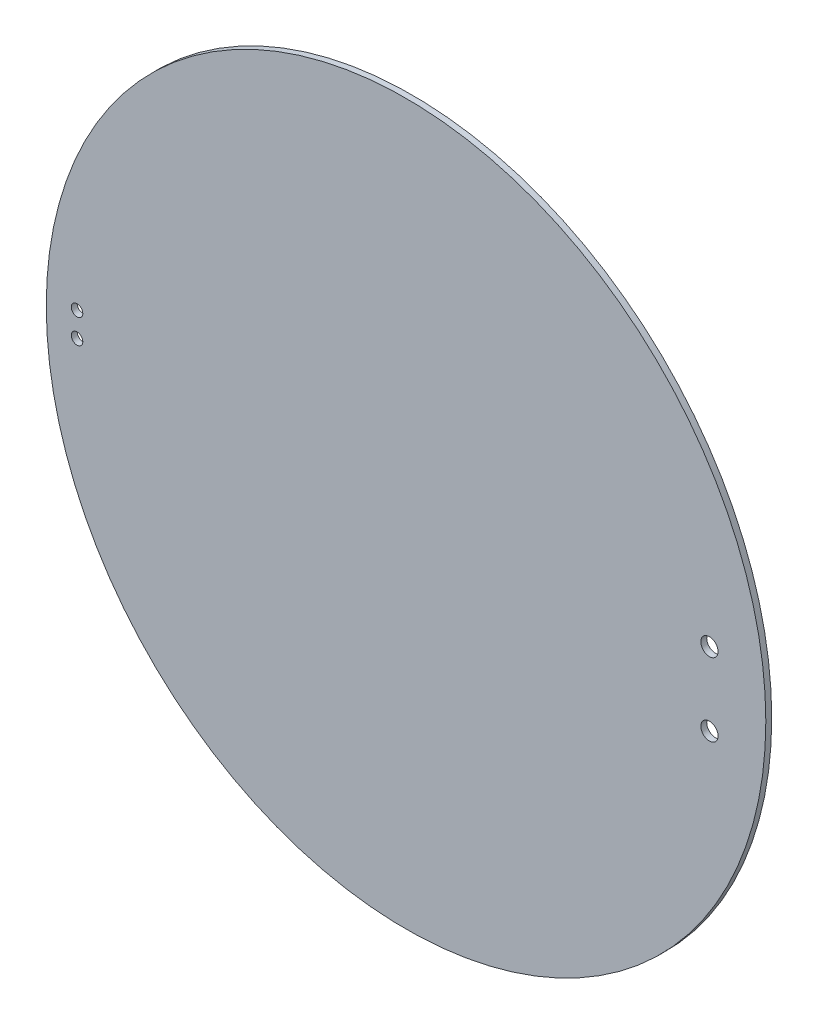
ISO-10303-21;
HEADER;
FILE_DESCRIPTION(('STEP AP214'),'2;1');
FILE_NAME('part.step','',(''),(''),'','','');
FILE_SCHEMA(('AUTOMOTIVE_DESIGN { 1 0 10303 214 1 1 1 1 }'));
ENDSEC;
DATA;
#1=APPLICATION_CONTEXT('core data for automotive mechanical design processes');
#2=APPLICATION_PROTOCOL_DEFINITION('international standard','automotive_design',2000,#1);
#3=PRODUCT_CONTEXT('',#1,'mechanical');
#4=PRODUCT('Part','Part','',(#3));
#5=PRODUCT_RELATED_PRODUCT_CATEGORY('part','',(#4));
#6=PRODUCT_DEFINITION_FORMATION('','',#4);
#7=PRODUCT_DEFINITION_CONTEXT('part definition',#1,'design');
#8=PRODUCT_DEFINITION('design','',#6,#7);
#9=PRODUCT_DEFINITION_SHAPE('','',#8);
#10=(LENGTH_UNIT() NAMED_UNIT(*) SI_UNIT(.MILLI.,.METRE.));
#11=(NAMED_UNIT(*) PLANE_ANGLE_UNIT() SI_UNIT($,.RADIAN.));
#12=(NAMED_UNIT(*) SI_UNIT($,.STERADIAN.) SOLID_ANGLE_UNIT());
#13=UNCERTAINTY_MEASURE_WITH_UNIT(LENGTH_MEASURE(1.E-05),#10,'distance_accuracy_value','');
#14=(GEOMETRIC_REPRESENTATION_CONTEXT(3) GLOBAL_UNCERTAINTY_ASSIGNED_CONTEXT((#13)) GLOBAL_UNIT_ASSIGNED_CONTEXT((#10,
#11,#12)) REPRESENTATION_CONTEXT('',''));
#15=CARTESIAN_POINT('',(0.,0.,0.));
#16=DIRECTION('',(0.,0.,1.));
#17=DIRECTION('',(1.,0.,0.));
#18=AXIS2_PLACEMENT_3D('',#15,#16,#17);
#19=CARTESIAN_POINT('',(126.2190008,74.549,0.41148));
#20=DIRECTION('',(0.,0.,-1.));
#21=DIRECTION('',(-1.,0.,0.));
#22=AXIS2_PLACEMENT_3D('',#19,#20,#21);
#23=PLANE('',#22);
#24=CARTESIAN_POINT('',(122.301,77.089,0.41148));
#25=DIRECTION('',(0.,0.,-1.));
#26=DIRECTION('',(-1.,0.,0.));
#27=AXIS2_PLACEMENT_3D('',#24,#25,#26);
#28=CIRCLE('',#27,0.5999988);
#29=CARTESIAN_POINT('',(121.7010012,77.089,0.41148));
#30=VERTEX_POINT('',#29);
#31=EDGE_CURVE('E38',#30,#30,#28,.T.);
#32=ORIENTED_EDGE('',*,*,#31,.T.);
#33=EDGE_LOOP('',(#32));
#34=FACE_BOUND('',#33,.T.);
#35=CARTESIAN_POINT('',(122.301,72.009,0.41148));
#36=DIRECTION('',(0.,0.,-1.));
#37=DIRECTION('',(-1.,0.,0.));
#38=AXIS2_PLACEMENT_3D('',#35,#36,#37);
#39=CIRCLE('',#38,0.5999988);
#40=CARTESIAN_POINT('',(121.7010012,72.009,0.41148));
#41=VERTEX_POINT('',#40);
#42=EDGE_CURVE('E41',#41,#41,#39,.T.);
#43=ORIENTED_EDGE('',*,*,#42,.T.);
#44=EDGE_LOOP('',(#43));
#45=FACE_BOUND('',#44,.T.);
#46=CARTESIAN_POINT('',(78.359,75.36000168,0.41148));
#47=DIRECTION('',(0.,0.,-1.));
#48=DIRECTION('',(-1.,0.,0.));
#49=AXIS2_PLACEMENT_3D('',#46,#47,#48);
#50=CIRCLE('',#49,0.3999992);
#51=CARTESIAN_POINT('',(77.9590008,75.36000168,0.41148));
#52=VERTEX_POINT('',#51);
#53=EDGE_CURVE('E44',#52,#52,#50,.T.);
#54=ORIENTED_EDGE('',*,*,#53,.T.);
#55=EDGE_LOOP('',(#54));
#56=FACE_BOUND('',#55,.T.);
#57=CARTESIAN_POINT('',(78.359,73.66,0.41148));
#58=DIRECTION('',(0.,0.,-1.));
#59=DIRECTION('',(-1.,0.,0.));
#60=AXIS2_PLACEMENT_3D('',#57,#58,#59);
#61=CIRCLE('',#60,0.3999992);
#62=CARTESIAN_POINT('',(77.9590008,73.66,0.41148));
#63=VERTEX_POINT('',#62);
#64=EDGE_CURVE('E46',#63,#63,#61,.T.);
#65=ORIENTED_EDGE('',*,*,#64,.T.);
#66=EDGE_LOOP('',(#65));
#67=FACE_BOUND('',#66,.T.);
#68=CARTESIAN_POINT('',(101.219,74.549,0.41148));
#69=DIRECTION('',(0.,0.,-1.));
#70=DIRECTION('',(-1.,0.,0.));
#71=AXIS2_PLACEMENT_3D('',#68,#69,#70);
#72=CIRCLE('',#71,25.0000008);
#73=CARTESIAN_POINT('',(76.2189992,74.549,0.41148));
#74=VERTEX_POINT('',#73);
#75=EDGE_CURVE('E18',#74,#74,#72,.T.);
#76=ORIENTED_EDGE('',*,*,#75,.F.);
#77=EDGE_LOOP('',(#76));
#78=FACE_BOUND('',#77,.T.);
#79=ADVANCED_FACE('F15',(#34,#45,#56,#67,#78),#23,.F.);
#80=CARTESIAN_POINT('',(101.219,74.549,0.));
#81=DIRECTION('',(0.,0.,-1.));
#82=DIRECTION('',(-1.,0.,0.));
#83=AXIS2_PLACEMENT_3D('',#80,#81,#82);
#84=CYLINDRICAL_SURFACE('',#83,25.0000008);
#85=ORIENTED_EDGE('',*,*,#75,.T.);
#86=EDGE_LOOP('',(#85));
#87=FACE_BOUND('',#86,.T.);
#88=CARTESIAN_POINT('',(101.219,74.549,0.));
#89=DIRECTION('',(0.,0.,-1.));
#90=DIRECTION('',(-1.,0.,0.));
#91=AXIS2_PLACEMENT_3D('',#88,#89,#90);
#92=CIRCLE('',#91,25.0000008);
#93=CARTESIAN_POINT('',(76.2189992,74.549,0.));
#94=VERTEX_POINT('',#93);
#95=EDGE_CURVE('E35',#94,#94,#92,.T.);
#96=ORIENTED_EDGE('',*,*,#95,.F.);
#97=EDGE_LOOP('',(#96));
#98=FACE_BOUND('',#97,.T.);
#99=ADVANCED_FACE('F53',(#87,#98),#84,.T.);
#100=CARTESIAN_POINT('',(78.359,73.66,0.));
#101=DIRECTION('',(0.,0.,-1.));
#102=DIRECTION('',(-1.,0.,0.));
#103=AXIS2_PLACEMENT_3D('',#100,#101,#102);
#104=CYLINDRICAL_SURFACE('',#103,0.3999992);
#105=ORIENTED_EDGE('',*,*,#64,.F.);
#106=EDGE_LOOP('',(#105));
#107=FACE_BOUND('',#106,.T.);
#108=CARTESIAN_POINT('',(78.359,73.66,0.));
#109=DIRECTION('',(0.,0.,-1.));
#110=DIRECTION('',(-1.,0.,0.));
#111=AXIS2_PLACEMENT_3D('',#108,#109,#110);
#112=CIRCLE('',#111,0.3999992);
#113=CARTESIAN_POINT('',(77.9590008,73.66,0.));
#114=VERTEX_POINT('',#113);
#115=EDGE_CURVE('E32',#114,#114,#112,.F.);
#116=ORIENTED_EDGE('',*,*,#115,.F.);
#117=EDGE_LOOP('',(#116));
#118=FACE_BOUND('',#117,.T.);
#119=ADVANCED_FACE('F62',(#107,#118),#104,.F.);
#120=CARTESIAN_POINT('',(78.359,75.36000168,0.));
#121=DIRECTION('',(0.,0.,-1.));
#122=DIRECTION('',(-1.,0.,0.));
#123=AXIS2_PLACEMENT_3D('',#120,#121,#122);
#124=CYLINDRICAL_SURFACE('',#123,0.3999992);
#125=ORIENTED_EDGE('',*,*,#53,.F.);
#126=EDGE_LOOP('',(#125));
#127=FACE_BOUND('',#126,.T.);
#128=CARTESIAN_POINT('',(78.359,75.36000168,0.));
#129=DIRECTION('',(0.,0.,-1.));
#130=DIRECTION('',(-1.,0.,0.));
#131=AXIS2_PLACEMENT_3D('',#128,#129,#130);
#132=CIRCLE('',#131,0.3999992);
#133=CARTESIAN_POINT('',(77.9590008,75.36000168,0.));
#134=VERTEX_POINT('',#133);
#135=EDGE_CURVE('E27',#134,#134,#132,.F.);
#136=ORIENTED_EDGE('',*,*,#135,.F.);
#137=EDGE_LOOP('',(#136));
#138=FACE_BOUND('',#137,.T.);
#139=ADVANCED_FACE('F78',(#127,#138),#124,.F.);
#140=CARTESIAN_POINT('',(122.301,72.009,0.));
#141=DIRECTION('',(0.,0.,-1.));
#142=DIRECTION('',(-1.,0.,0.));
#143=AXIS2_PLACEMENT_3D('',#140,#141,#142);
#144=CYLINDRICAL_SURFACE('',#143,0.5999988);
#145=ORIENTED_EDGE('',*,*,#42,.F.);
#146=EDGE_LOOP('',(#145));
#147=FACE_BOUND('',#146,.T.);
#148=CARTESIAN_POINT('',(122.301,72.009,0.));
#149=DIRECTION('',(0.,0.,-1.));
#150=DIRECTION('',(-1.,0.,0.));
#151=AXIS2_PLACEMENT_3D('',#148,#149,#150);
#152=CIRCLE('',#151,0.5999988);
#153=CARTESIAN_POINT('',(121.7010012,72.009,0.));
#154=VERTEX_POINT('',#153);
#155=EDGE_CURVE('E22',#154,#154,#152,.F.);
#156=ORIENTED_EDGE('',*,*,#155,.F.);
#157=EDGE_LOOP('',(#156));
#158=FACE_BOUND('',#157,.T.);
#159=ADVANCED_FACE('F71',(#147,#158),#144,.F.);
#160=CARTESIAN_POINT('',(122.301,77.089,0.));
#161=DIRECTION('',(0.,0.,-1.));
#162=DIRECTION('',(-1.,0.,0.));
#163=AXIS2_PLACEMENT_3D('',#160,#161,#162);
#164=CYLINDRICAL_SURFACE('',#163,0.5999988);
#165=ORIENTED_EDGE('',*,*,#31,.F.);
#166=EDGE_LOOP('',(#165));
#167=FACE_BOUND('',#166,.T.);
#168=CARTESIAN_POINT('',(122.301,77.089,0.));
#169=DIRECTION('',(0.,0.,-1.));
#170=DIRECTION('',(-1.,0.,0.));
#171=AXIS2_PLACEMENT_3D('',#168,#169,#170);
#172=CIRCLE('',#171,0.5999988);
#173=CARTESIAN_POINT('',(121.7010012,77.089,0.));
#174=VERTEX_POINT('',#173);
#175=EDGE_CURVE('E10',#174,#174,#172,.F.);
#176=ORIENTED_EDGE('',*,*,#175,.F.);
#177=EDGE_LOOP('',(#176));
#178=FACE_BOUND('',#177,.T.);
#179=ADVANCED_FACE('F66',(#167,#178),#164,.F.);
#180=CARTESIAN_POINT('',(126.2190008,74.549,0.));
#181=DIRECTION('',(0.,0.,-1.));
#182=DIRECTION('',(-1.,0.,0.));
#183=AXIS2_PLACEMENT_3D('',#180,#181,#182);
#184=PLANE('',#183);
#185=ORIENTED_EDGE('',*,*,#175,.T.);
#186=EDGE_LOOP('',(#185));
#187=FACE_BOUND('',#186,.T.);
#188=ORIENTED_EDGE('',*,*,#155,.T.);
#189=EDGE_LOOP('',(#188));
#190=FACE_BOUND('',#189,.T.);
#191=ORIENTED_EDGE('',*,*,#135,.T.);
#192=EDGE_LOOP('',(#191));
#193=FACE_BOUND('',#192,.T.);
#194=ORIENTED_EDGE('',*,*,#115,.T.);
#195=EDGE_LOOP('',(#194));
#196=FACE_BOUND('',#195,.T.);
#197=ORIENTED_EDGE('',*,*,#95,.T.);
#198=EDGE_LOOP('',(#197));
#199=FACE_BOUND('',#198,.T.);
#200=ADVANCED_FACE('F64',(#187,#190,#193,#196,#199),#184,.T.);
#201=CLOSED_SHELL('',(#79,#99,#119,#139,#159,#179,#200));
#202=MANIFOLD_SOLID_BREP('B1',#201);
#203=ADVANCED_BREP_SHAPE_REPRESENTATION('',(#18,#202),#14);
#204=SHAPE_DEFINITION_REPRESENTATION(#9,#203);
ENDSEC;
END-ISO-10303-21;
